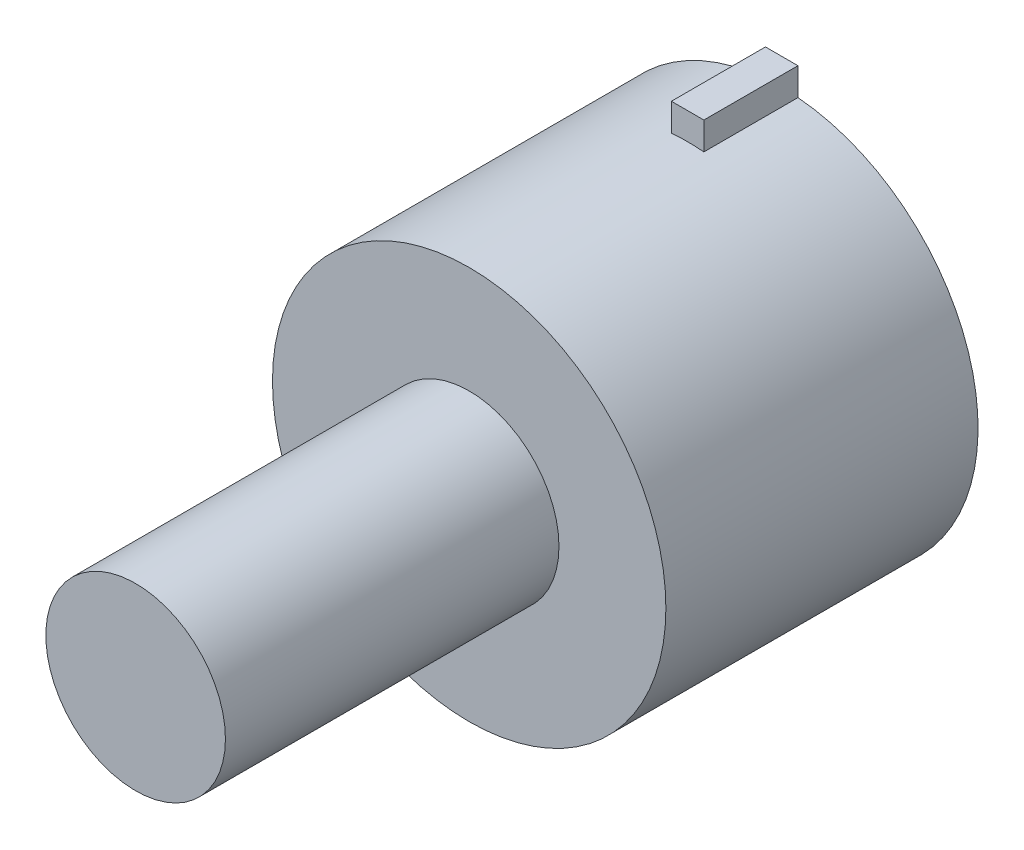
ISO-10303-21;
HEADER;
FILE_DESCRIPTION(('STEP AP214'),'2;1');
FILE_NAME('part.step','',(''),(''),'','','');
FILE_SCHEMA(('AUTOMOTIVE_DESIGN { 1 0 10303 214 1 1 1 1 }'));
ENDSEC;
DATA;
#1=APPLICATION_CONTEXT('core data for automotive mechanical design processes');
#2=APPLICATION_PROTOCOL_DEFINITION('international standard','automotive_design',2000,#1);
#3=PRODUCT_CONTEXT('',#1,'mechanical');
#4=PRODUCT('Part','Part','',(#3));
#5=PRODUCT_RELATED_PRODUCT_CATEGORY('part','',(#4));
#6=PRODUCT_DEFINITION_FORMATION('','',#4);
#7=PRODUCT_DEFINITION_CONTEXT('part definition',#1,'design');
#8=PRODUCT_DEFINITION('design','',#6,#7);
#9=PRODUCT_DEFINITION_SHAPE('','',#8);
#10=(LENGTH_UNIT() NAMED_UNIT(*) SI_UNIT(.MILLI.,.METRE.));
#11=(NAMED_UNIT(*) PLANE_ANGLE_UNIT() SI_UNIT($,.RADIAN.));
#12=(NAMED_UNIT(*) SI_UNIT($,.STERADIAN.) SOLID_ANGLE_UNIT());
#13=UNCERTAINTY_MEASURE_WITH_UNIT(LENGTH_MEASURE(1.E-05),#10,'distance_accuracy_value','');
#14=(GEOMETRIC_REPRESENTATION_CONTEXT(3) GLOBAL_UNCERTAINTY_ASSIGNED_CONTEXT((#13)) GLOBAL_UNIT_ASSIGNED_CONTEXT((#10,
#11,#12)) REPRESENTATION_CONTEXT('',''));
#15=CARTESIAN_POINT('',(0.,0.,0.));
#16=DIRECTION('',(0.,0.,1.));
#17=DIRECTION('',(1.,0.,0.));
#18=AXIS2_PLACEMENT_3D('',#15,#16,#17);
#19=CARTESIAN_POINT('',(0.,0.,7.3));
#20=DIRECTION('',(0.,0.,-1.));
#21=DIRECTION('',(-1.,0.,0.));
#22=AXIS2_PLACEMENT_3D('',#19,#20,#21);
#23=CYLINDRICAL_SURFACE('',#22,4.6);
#24=CARTESIAN_POINT('',(0.,0.,7.3));
#25=DIRECTION('',(0.,0.,1.));
#26=DIRECTION('',(1.,0.,0.));
#27=AXIS2_PLACEMENT_3D('',#24,#25,#26);
#28=CIRCLE('',#27,4.6);
#29=CARTESIAN_POINT('',(4.6,0.,7.3));
#30=VERTEX_POINT('',#29);
#31=EDGE_CURVE('E110',#30,#30,#28,.T.);
#32=ORIENTED_EDGE('',*,*,#31,.F.);
#33=EDGE_LOOP('',(#32));
#34=FACE_BOUND('',#33,.T.);
#35=DIRECTION('',(0.,0.,-1.));
#36=VECTOR('',#35,1.);
#37=CARTESIAN_POINT('',(-0.371458991148649,4.58497745009666,7.3));
#38=LINE('',#37,#36);
#39=CARTESIAN_POINT('',(-0.371458991148649,4.58497745009666,0.));
#40=VERTEX_POINT('',#39);
#41=CARTESIAN_POINT('',(-0.371458991148649,4.58497745009666,2.2));
#42=VERTEX_POINT('',#41);
#43=EDGE_CURVE('E102',#40,#42,#38,.F.);
#44=ORIENTED_EDGE('',*,*,#43,.F.);
#45=CARTESIAN_POINT('',(0.,0.,0.));
#46=DIRECTION('',(0.,0.,1.));
#47=DIRECTION('',(1.,0.,0.));
#48=AXIS2_PLACEMENT_3D('',#45,#46,#47);
#49=CIRCLE('',#48,4.6);
#50=CARTESIAN_POINT('',(0.388541008851351,4.58356148474533,0.));
#51=VERTEX_POINT('',#50);
#52=EDGE_CURVE('E107',#40,#51,#49,.T.);
#53=ORIENTED_EDGE('',*,*,#52,.T.);
#54=DIRECTION('',(0.,0.,-1.));
#55=VECTOR('',#54,1.);
#56=CARTESIAN_POINT('',(0.388541008851351,4.58356148474533,7.3));
#57=LINE('',#56,#55);
#58=CARTESIAN_POINT('',(0.388541008851351,4.58356148474533,2.2));
#59=VERTEX_POINT('',#58);
#60=EDGE_CURVE('E47',#59,#51,#57,.T.);
#61=ORIENTED_EDGE('',*,*,#60,.F.);
#62=CARTESIAN_POINT('',(0.,0.,2.2));
#63=DIRECTION('',(0.,0.,-1.));
#64=DIRECTION('',(-1.,0.,0.));
#65=AXIS2_PLACEMENT_3D('',#62,#63,#64);
#66=CIRCLE('',#65,4.6);
#67=EDGE_CURVE('E11',#42,#59,#66,.T.);
#68=ORIENTED_EDGE('',*,*,#67,.F.);
#69=EDGE_LOOP('',(#44,#53,#61,#68));
#70=FACE_BOUND('',#69,.T.);
#71=ADVANCED_FACE('F33',(#34,#70),#23,.T.);
#72=CARTESIAN_POINT('',(0.,0.,7.3));
#73=DIRECTION('',(0.,0.,1.));
#74=DIRECTION('',(1.,0.,0.));
#75=AXIS2_PLACEMENT_3D('',#72,#73,#74);
#76=PLANE('',#75);
#77=CARTESIAN_POINT('',(0.,0.,7.3));
#78=DIRECTION('',(0.,0.,1.));
#79=DIRECTION('',(1.,0.,0.));
#80=AXIS2_PLACEMENT_3D('',#77,#78,#79);
#81=CIRCLE('',#80,2.1);
#82=CARTESIAN_POINT('',(2.1,0.,7.3));
#83=VERTEX_POINT('',#82);
#84=EDGE_CURVE('E40',#83,#83,#81,.T.);
#85=ORIENTED_EDGE('',*,*,#84,.F.);
#86=EDGE_LOOP('',(#85));
#87=FACE_BOUND('',#86,.T.);
#88=ORIENTED_EDGE('',*,*,#31,.T.);
#89=EDGE_LOOP('',(#88));
#90=FACE_BOUND('',#89,.T.);
#91=ADVANCED_FACE('F129',(#87,#90),#76,.T.);
#92=CARTESIAN_POINT('',(0.,0.,0.));
#93=DIRECTION('',(0.,0.,1.));
#94=DIRECTION('',(1.,0.,0.));
#95=AXIS2_PLACEMENT_3D('',#92,#93,#94);
#96=PLANE('',#95);
#97=ORIENTED_EDGE('',*,*,#52,.F.);
#98=DIRECTION('',(0.,-1.,0.));
#99=VECTOR('',#98,1.);
#100=CARTESIAN_POINT('',(-0.371458991148649,4.53,0.));
#101=LINE('',#100,#99);
#102=CARTESIAN_POINT('',(-0.371458991148649,5.23,0.));
#103=VERTEX_POINT('',#102);
#104=EDGE_CURVE('E95',#103,#40,#101,.T.);
#105=ORIENTED_EDGE('',*,*,#104,.F.);
#106=DIRECTION('',(-1.,0.,0.));
#107=VECTOR('',#106,1.);
#108=CARTESIAN_POINT('',(-0.371458991148649,5.23,0.));
#109=LINE('',#108,#107);
#110=CARTESIAN_POINT('',(0.388541008851351,5.23,0.));
#111=VERTEX_POINT('',#110);
#112=EDGE_CURVE('E99',#111,#103,#109,.T.);
#113=ORIENTED_EDGE('',*,*,#112,.F.);
#114=DIRECTION('',(0.,1.,0.));
#115=VECTOR('',#114,1.);
#116=CARTESIAN_POINT('',(0.388541008851351,4.53,0.));
#117=LINE('',#116,#115);
#118=EDGE_CURVE('E83',#51,#111,#117,.T.);
#119=ORIENTED_EDGE('',*,*,#118,.F.);
#120=EDGE_LOOP('',(#97,#105,#113,#119));
#121=FACE_BOUND('',#120,.T.);
#122=ADVANCED_FACE('F114',(#121),#96,.F.);
#123=CARTESIAN_POINT('',(0.,0.,15.1));
#124=DIRECTION('',(0.,0.,-1.));
#125=DIRECTION('',(-1.,0.,0.));
#126=AXIS2_PLACEMENT_3D('',#123,#124,#125);
#127=CYLINDRICAL_SURFACE('',#126,2.1);
#128=CARTESIAN_POINT('',(0.,0.,15.1));
#129=DIRECTION('',(0.,0.,1.));
#130=DIRECTION('',(1.,0.,0.));
#131=AXIS2_PLACEMENT_3D('',#128,#129,#130);
#132=CIRCLE('',#131,2.1);
#133=CARTESIAN_POINT('',(2.1,0.,15.1));
#134=VERTEX_POINT('',#133);
#135=EDGE_CURVE('E104',#134,#134,#132,.T.);
#136=ORIENTED_EDGE('',*,*,#135,.F.);
#137=EDGE_LOOP('',(#136));
#138=FACE_BOUND('',#137,.T.);
#139=ORIENTED_EDGE('',*,*,#84,.T.);
#140=EDGE_LOOP('',(#139));
#141=FACE_BOUND('',#140,.T.);
#142=ADVANCED_FACE('F125',(#138,#141),#127,.T.);
#143=CARTESIAN_POINT('',(0.,0.,15.1));
#144=DIRECTION('',(0.,0.,1.));
#145=DIRECTION('',(1.,0.,0.));
#146=AXIS2_PLACEMENT_3D('',#143,#144,#145);
#147=PLANE('',#146);
#148=ORIENTED_EDGE('',*,*,#135,.T.);
#149=EDGE_LOOP('',(#148));
#150=FACE_BOUND('',#149,.T.);
#151=ADVANCED_FACE('F118',(#150),#147,.T.);
#152=CARTESIAN_POINT('',(-0.371458991148649,4.53,2.2));
#153=DIRECTION('',(1.,0.,0.));
#154=DIRECTION('',(0.,0.,-1.));
#155=AXIS2_PLACEMENT_3D('',#152,#153,#154);
#156=PLANE('',#155);
#157=ORIENTED_EDGE('',*,*,#104,.T.);
#158=ORIENTED_EDGE('',*,*,#43,.T.);
#159=DIRECTION('',(0.,-1.,0.));
#160=VECTOR('',#159,1.);
#161=CARTESIAN_POINT('',(-0.371458991148649,4.53,2.2));
#162=LINE('',#161,#160);
#163=CARTESIAN_POINT('',(-0.371458991148649,5.23,2.2));
#164=VERTEX_POINT('',#163);
#165=EDGE_CURVE('E77',#164,#42,#162,.T.);
#166=ORIENTED_EDGE('',*,*,#165,.F.);
#167=DIRECTION('',(0.,0.,-1.));
#168=VECTOR('',#167,1.);
#169=CARTESIAN_POINT('',(-0.371458991148649,5.23,2.2));
#170=LINE('',#169,#168);
#171=EDGE_CURVE('E86',#164,#103,#170,.T.);
#172=ORIENTED_EDGE('',*,*,#171,.T.);
#173=EDGE_LOOP('',(#157,#158,#166,#172));
#174=FACE_BOUND('',#173,.T.);
#175=ADVANCED_FACE('F116',(#174),#156,.F.);
#176=CARTESIAN_POINT('',(0.388541008851351,4.53,2.2));
#177=DIRECTION('',(-1.,0.,0.));
#178=DIRECTION('',(0.,0.,1.));
#179=AXIS2_PLACEMENT_3D('',#176,#177,#178);
#180=PLANE('',#179);
#181=DIRECTION('',(0.,1.,0.));
#182=VECTOR('',#181,1.);
#183=CARTESIAN_POINT('',(0.388541008851351,4.53,2.2));
#184=LINE('',#183,#182);
#185=CARTESIAN_POINT('',(0.388541008851351,5.23,2.2));
#186=VERTEX_POINT('',#185);
#187=EDGE_CURVE('E69',#59,#186,#184,.T.);
#188=ORIENTED_EDGE('',*,*,#187,.F.);
#189=ORIENTED_EDGE('',*,*,#60,.T.);
#190=ORIENTED_EDGE('',*,*,#118,.T.);
#191=DIRECTION('',(0.,0.,-1.));
#192=VECTOR('',#191,1.);
#193=CARTESIAN_POINT('',(0.388541008851351,5.23,2.2));
#194=LINE('',#193,#192);
#195=EDGE_CURVE('E80',#186,#111,#194,.T.);
#196=ORIENTED_EDGE('',*,*,#195,.F.);
#197=EDGE_LOOP('',(#188,#189,#190,#196));
#198=FACE_BOUND('',#197,.T.);
#199=ADVANCED_FACE('F81',(#198),#180,.F.);
#200=CARTESIAN_POINT('',(-0.371458991148649,5.23,2.2));
#201=DIRECTION('',(0.,-1.,0.));
#202=DIRECTION('',(0.,0.,-1.));
#203=AXIS2_PLACEMENT_3D('',#200,#201,#202);
#204=PLANE('',#203);
#205=ORIENTED_EDGE('',*,*,#112,.T.);
#206=ORIENTED_EDGE('',*,*,#171,.F.);
#207=DIRECTION('',(-1.,0.,0.));
#208=VECTOR('',#207,1.);
#209=CARTESIAN_POINT('',(-0.371458991148649,5.23,2.2));
#210=LINE('',#209,#208);
#211=EDGE_CURVE('E74',#186,#164,#210,.T.);
#212=ORIENTED_EDGE('',*,*,#211,.F.);
#213=ORIENTED_EDGE('',*,*,#195,.T.);
#214=EDGE_LOOP('',(#205,#206,#212,#213));
#215=FACE_BOUND('',#214,.T.);
#216=ADVANCED_FACE('F88',(#215),#204,.F.);
#217=CARTESIAN_POINT('',(0.,0.,2.2));
#218=DIRECTION('',(0.,0.,-1.));
#219=DIRECTION('',(-1.,0.,0.));
#220=AXIS2_PLACEMENT_3D('',#217,#218,#219);
#221=PLANE('',#220);
#222=ORIENTED_EDGE('',*,*,#165,.T.);
#223=ORIENTED_EDGE('',*,*,#67,.T.);
#224=ORIENTED_EDGE('',*,*,#187,.T.);
#225=ORIENTED_EDGE('',*,*,#211,.T.);
#226=EDGE_LOOP('',(#222,#223,#224,#225));
#227=FACE_BOUND('',#226,.T.);
#228=ADVANCED_FACE('F72',(#227),#221,.F.);
#229=CLOSED_SHELL('',(#71,#91,#122,#142,#151,#175,#199,#216,#228));
#230=MANIFOLD_SOLID_BREP('B2',#229);
#231=ADVANCED_BREP_SHAPE_REPRESENTATION('',(#18,#230),#14);
#232=SHAPE_DEFINITION_REPRESENTATION(#9,#231);
ENDSEC;
END-ISO-10303-21;
